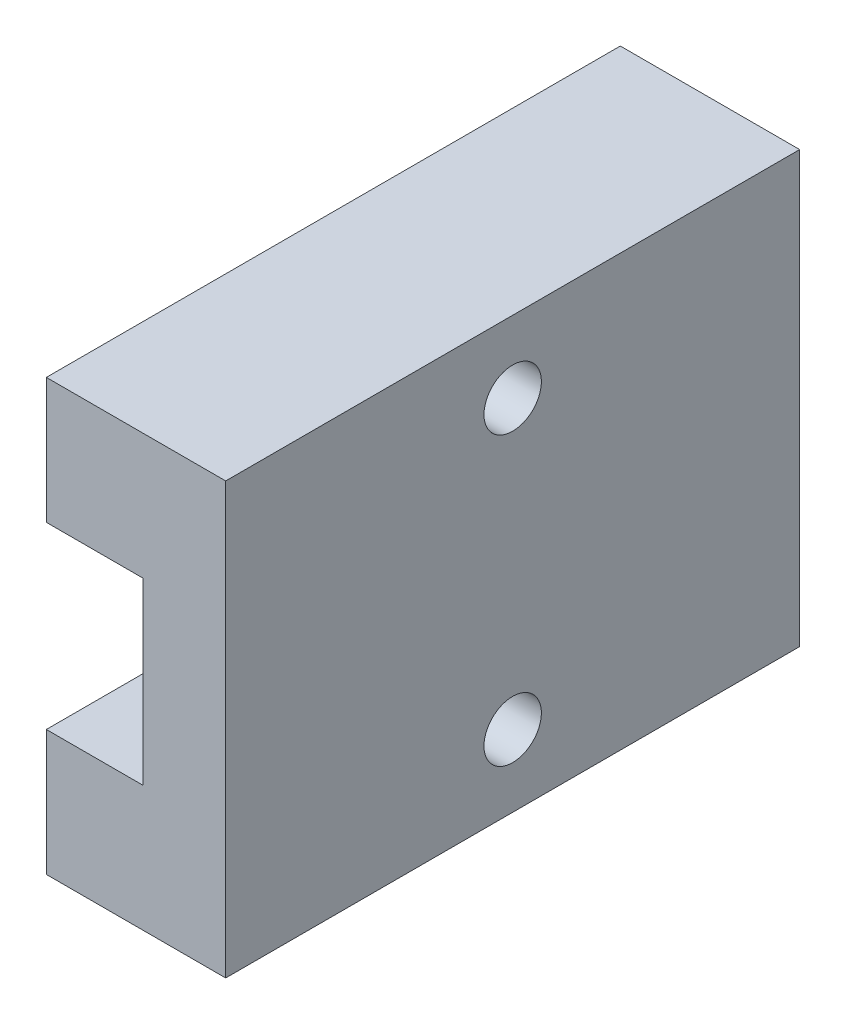
ISO-10303-21;
HEADER;
FILE_DESCRIPTION(('STEP AP214'),'2;1');
FILE_NAME('part.step','',(''),(''),'','','');
FILE_SCHEMA(('AUTOMOTIVE_DESIGN { 1 0 10303 214 1 1 1 1 }'));
ENDSEC;
DATA;
#1=APPLICATION_CONTEXT('core data for automotive mechanical design processes');
#2=APPLICATION_PROTOCOL_DEFINITION('international standard','automotive_design',2000,#1);
#3=PRODUCT_CONTEXT('',#1,'mechanical');
#4=PRODUCT('Part','Part','',(#3));
#5=PRODUCT_RELATED_PRODUCT_CATEGORY('part','',(#4));
#6=PRODUCT_DEFINITION_FORMATION('','',#4);
#7=PRODUCT_DEFINITION_CONTEXT('part definition',#1,'design');
#8=PRODUCT_DEFINITION('design','',#6,#7);
#9=PRODUCT_DEFINITION_SHAPE('','',#8);
#10=(LENGTH_UNIT() NAMED_UNIT(*) SI_UNIT(.MILLI.,.METRE.));
#11=(NAMED_UNIT(*) PLANE_ANGLE_UNIT() SI_UNIT($,.RADIAN.));
#12=(NAMED_UNIT(*) SI_UNIT($,.STERADIAN.) SOLID_ANGLE_UNIT());
#13=UNCERTAINTY_MEASURE_WITH_UNIT(LENGTH_MEASURE(1.E-05),#10,'distance_accuracy_value','');
#14=(GEOMETRIC_REPRESENTATION_CONTEXT(3) GLOBAL_UNCERTAINTY_ASSIGNED_CONTEXT((#13)) GLOBAL_UNIT_ASSIGNED_CONTEXT((#10,
#11,#12)) REPRESENTATION_CONTEXT('',''));
#15=CARTESIAN_POINT('',(0.,0.,0.));
#16=DIRECTION('',(0.,0.,1.));
#17=DIRECTION('',(1.,0.,0.));
#18=AXIS2_PLACEMENT_3D('',#15,#16,#17);
#19=CARTESIAN_POINT('',(-4.5,4.,81.949300195452));
#20=DIRECTION('',(1.,0.,0.));
#21=DIRECTION('',(0.,0.,1.));
#22=AXIS2_PLACEMENT_3D('',#19,#20,#21);
#23=CYLINDRICAL_SURFACE('',#22,0.8);
#24=CARTESIAN_POINT('',(-7.7,4.,81.949300195452));
#25=DIRECTION('',(1.,0.,0.));
#26=DIRECTION('',(0.,0.,1.));
#27=AXIS2_PLACEMENT_3D('',#24,#25,#26);
#28=CIRCLE('',#27,0.8);
#29=CARTESIAN_POINT('',(-7.7,4.,82.749300195452));
#30=VERTEX_POINT('',#29);
#31=EDGE_CURVE('E11',#30,#30,#28,.T.);
#32=ORIENTED_EDGE('',*,*,#31,.F.);
#33=EDGE_LOOP('',(#32));
#34=FACE_BOUND('',#33,.T.);
#35=CARTESIAN_POINT('',(-4.5,4.,81.949300195452));
#36=DIRECTION('',(1.,0.,0.));
#37=DIRECTION('',(0.,0.,1.));
#38=AXIS2_PLACEMENT_3D('',#35,#36,#37);
#39=CIRCLE('',#38,0.79999999999999);
#40=CARTESIAN_POINT('',(-4.5,4.,82.749300195452));
#41=VERTEX_POINT('',#40);
#42=EDGE_CURVE('E149',#41,#41,#39,.T.);
#43=ORIENTED_EDGE('',*,*,#42,.T.);
#44=EDGE_LOOP('',(#43));
#45=FACE_BOUND('',#44,.T.);
#46=ADVANCED_FACE('F36',(#34,#45),#23,.F.);
#47=CARTESIAN_POINT('',(-7.7,4.,81.949300195452));
#48=DIRECTION('',(1.,0.,0.));
#49=DIRECTION('',(0.,0.,1.));
#50=AXIS2_PLACEMENT_3D('',#47,#48,#49);
#51=CONICAL_SURFACE('',#50,0.8,1.02974425867665);
#52=CARTESIAN_POINT('',(-8.18068849522205,4.,81.949300195452));
#53=VERTEX_POINT('',#52);
#54=VERTEX_LOOP('',#53);
#55=FACE_BOUND('',#54,.T.);
#56=ORIENTED_EDGE('',*,*,#31,.T.);
#57=EDGE_LOOP('',(#56));
#58=FACE_BOUND('',#57,.T.);
#59=ADVANCED_FACE('F333',(#55,#58),#51,.F.);
#60=CARTESIAN_POINT('',(-4.5,-4.,81.949300195452));
#61=DIRECTION('',(1.,0.,0.));
#62=DIRECTION('',(0.,0.,1.));
#63=AXIS2_PLACEMENT_3D('',#60,#61,#62);
#64=CYLINDRICAL_SURFACE('',#63,0.8);
#65=CARTESIAN_POINT('',(-7.7,-4.,81.949300195452));
#66=DIRECTION('',(1.,0.,0.));
#67=DIRECTION('',(0.,0.,1.));
#68=AXIS2_PLACEMENT_3D('',#65,#66,#67);
#69=CIRCLE('',#68,0.8);
#70=CARTESIAN_POINT('',(-7.7,-4.,82.749300195452));
#71=VERTEX_POINT('',#70);
#72=EDGE_CURVE('E46',#71,#71,#69,.T.);
#73=ORIENTED_EDGE('',*,*,#72,.F.);
#74=EDGE_LOOP('',(#73));
#75=FACE_BOUND('',#74,.T.);
#76=CARTESIAN_POINT('',(-4.5,-4.,81.949300195452));
#77=DIRECTION('',(1.,0.,0.));
#78=DIRECTION('',(0.,0.,1.));
#79=AXIS2_PLACEMENT_3D('',#76,#77,#78);
#80=CIRCLE('',#79,0.79999999999999);
#81=CARTESIAN_POINT('',(-4.5,-4.,82.749300195452));
#82=VERTEX_POINT('',#81);
#83=EDGE_CURVE('E196',#82,#82,#80,.T.);
#84=ORIENTED_EDGE('',*,*,#83,.T.);
#85=EDGE_LOOP('',(#84));
#86=FACE_BOUND('',#85,.T.);
#87=ADVANCED_FACE('F38',(#75,#86),#64,.F.);
#88=CARTESIAN_POINT('',(-7.7,-4.,81.949300195452));
#89=DIRECTION('',(1.,0.,0.));
#90=DIRECTION('',(0.,0.,1.));
#91=AXIS2_PLACEMENT_3D('',#88,#89,#90);
#92=CONICAL_SURFACE('',#91,0.8,1.02974425867665);
#93=CARTESIAN_POINT('',(-8.18068849522205,-4.,81.949300195452));
#94=VERTEX_POINT('',#93);
#95=VERTEX_LOOP('',#94);
#96=FACE_BOUND('',#95,.T.);
#97=ORIENTED_EDGE('',*,*,#72,.T.);
#98=EDGE_LOOP('',(#97));
#99=FACE_BOUND('',#98,.T.);
#100=ADVANCED_FACE('F136',(#96,#99),#92,.F.);
#101=CARTESIAN_POINT('',(-6.8,0.,73.949300195452));
#102=DIRECTION('',(1.,0.,0.));
#103=DIRECTION('',(0.,-1.,0.));
#104=AXIS2_PLACEMENT_3D('',#101,#102,#103);
#105=PLANE('',#104);
#106=DIRECTION('',(0.,1.,0.));
#107=VECTOR('',#106,1.);
#108=CARTESIAN_POINT('',(-6.8,0.,89.949300195452));
#109=LINE('',#108,#107);
#110=CARTESIAN_POINT('',(-6.8,-2.5,89.949300195452));
#111=VERTEX_POINT('',#110);
#112=CARTESIAN_POINT('',(-6.8,2.5,89.949300195452));
#113=VERTEX_POINT('',#112);
#114=EDGE_CURVE('E205',#111,#113,#109,.T.);
#115=ORIENTED_EDGE('',*,*,#114,.T.);
#116=DIRECTION('',(0.,0.,-1.));
#117=VECTOR('',#116,1.);
#118=CARTESIAN_POINT('',(-6.8,2.5,93.9106374606166));
#119=LINE('',#118,#117);
#120=CARTESIAN_POINT('',(-6.8,2.5,73.949300195452));
#121=VERTEX_POINT('',#120);
#122=EDGE_CURVE('E144',#113,#121,#119,.T.);
#123=ORIENTED_EDGE('',*,*,#122,.T.);
#124=DIRECTION('',(0.,1.,0.));
#125=VECTOR('',#124,1.);
#126=CARTESIAN_POINT('',(-6.8,0.,73.949300195452));
#127=LINE('',#126,#125);
#128=CARTESIAN_POINT('',(-6.8,-2.5,73.949300195452));
#129=VERTEX_POINT('',#128);
#130=EDGE_CURVE('E155',#129,#121,#127,.T.);
#131=ORIENTED_EDGE('',*,*,#130,.F.);
#132=DIRECTION('',(0.,0.,1.));
#133=VECTOR('',#132,1.);
#134=CARTESIAN_POINT('',(-6.8,-2.5,93.9106374606166));
#135=LINE('',#134,#133);
#136=EDGE_CURVE('E139',#129,#111,#135,.T.);
#137=ORIENTED_EDGE('',*,*,#136,.T.);
#138=EDGE_LOOP('',(#115,#123,#131,#137));
#139=FACE_BOUND('',#138,.T.);
#140=ADVANCED_FACE('F313',(#139),#105,.F.);
#141=CARTESIAN_POINT('',(-6.8,-2.5,93.9106374606166));
#142=DIRECTION('',(0.,-1.,0.));
#143=DIRECTION('',(1.,0.,0.));
#144=AXIS2_PLACEMENT_3D('',#141,#142,#143);
#145=PLANE('',#144);
#146=DIRECTION('',(1.,0.,0.));
#147=VECTOR('',#146,1.);
#148=CARTESIAN_POINT('',(-7.,-2.5,89.949300195452));
#149=LINE('',#148,#147);
#150=CARTESIAN_POINT('',(-9.5,-2.5,89.949300195452));
#151=VERTEX_POINT('',#150);
#152=EDGE_CURVE('E215',#151,#111,#149,.T.);
#153=ORIENTED_EDGE('',*,*,#152,.T.);
#154=ORIENTED_EDGE('',*,*,#136,.F.);
#155=DIRECTION('',(1.,0.,0.));
#156=VECTOR('',#155,1.);
#157=CARTESIAN_POINT('',(-7.,-2.5,73.949300195452));
#158=LINE('',#157,#156);
#159=CARTESIAN_POINT('',(-9.5,-2.5,73.949300195452));
#160=VERTEX_POINT('',#159);
#161=EDGE_CURVE('E154',#160,#129,#158,.T.);
#162=ORIENTED_EDGE('',*,*,#161,.F.);
#163=DIRECTION('',(0.,0.,1.));
#164=VECTOR('',#163,1.);
#165=CARTESIAN_POINT('',(-9.5,-2.5,93.9106374606166));
#166=LINE('',#165,#164);
#167=EDGE_CURVE('E186',#160,#151,#166,.T.);
#168=ORIENTED_EDGE('',*,*,#167,.T.);
#169=EDGE_LOOP('',(#153,#154,#162,#168));
#170=FACE_BOUND('',#169,.T.);
#171=ADVANCED_FACE('F304',(#170),#145,.F.);
#172=CARTESIAN_POINT('',(-6.8,2.5,93.9106374606166));
#173=DIRECTION('',(0.,1.,0.));
#174=DIRECTION('',(1.,0.,0.));
#175=AXIS2_PLACEMENT_3D('',#172,#173,#174);
#176=PLANE('',#175);
#177=DIRECTION('',(-1.,0.,0.));
#178=VECTOR('',#177,1.);
#179=CARTESIAN_POINT('',(-7.,2.5,89.949300195452));
#180=LINE('',#179,#178);
#181=CARTESIAN_POINT('',(-9.5,2.5,89.949300195452));
#182=VERTEX_POINT('',#181);
#183=EDGE_CURVE('E199',#113,#182,#180,.T.);
#184=ORIENTED_EDGE('',*,*,#183,.T.);
#185=DIRECTION('',(0.,0.,-1.));
#186=VECTOR('',#185,1.);
#187=CARTESIAN_POINT('',(-9.5,2.5,93.9106374606166));
#188=LINE('',#187,#186);
#189=CARTESIAN_POINT('',(-9.5,2.5,73.949300195452));
#190=VERTEX_POINT('',#189);
#191=EDGE_CURVE('E185',#182,#190,#188,.T.);
#192=ORIENTED_EDGE('',*,*,#191,.T.);
#193=DIRECTION('',(-1.,0.,0.));
#194=VECTOR('',#193,1.);
#195=CARTESIAN_POINT('',(-7.,2.5,73.949300195452));
#196=LINE('',#195,#194);
#197=EDGE_CURVE('E151',#121,#190,#196,.T.);
#198=ORIENTED_EDGE('',*,*,#197,.F.);
#199=ORIENTED_EDGE('',*,*,#122,.F.);
#200=EDGE_LOOP('',(#184,#192,#198,#199));
#201=FACE_BOUND('',#200,.T.);
#202=ADVANCED_FACE('F265',(#201),#176,.F.);
#203=CARTESIAN_POINT('',(-7.,0.,73.949300195452));
#204=DIRECTION('',(0.,0.,1.));
#205=DIRECTION('',(0.,-1.,0.));
#206=AXIS2_PLACEMENT_3D('',#203,#204,#205);
#207=PLANE('',#206);
#208=ORIENTED_EDGE('',*,*,#130,.T.);
#209=ORIENTED_EDGE('',*,*,#197,.T.);
#210=DIRECTION('',(0.,-1.,0.));
#211=VECTOR('',#210,1.);
#212=CARTESIAN_POINT('',(-9.5,-6.,73.949300195452));
#213=LINE('',#212,#211);
#214=CARTESIAN_POINT('',(-9.5,6.,73.949300195452));
#215=VERTEX_POINT('',#214);
#216=EDGE_CURVE('E181',#215,#190,#213,.T.);
#217=ORIENTED_EDGE('',*,*,#216,.F.);
#218=DIRECTION('',(-1.,0.,0.));
#219=VECTOR('',#218,1.);
#220=CARTESIAN_POINT('',(-9.5,6.,73.949300195452));
#221=LINE('',#220,#219);
#222=CARTESIAN_POINT('',(-4.5,6.,73.949300195452));
#223=VERTEX_POINT('',#222);
#224=EDGE_CURVE('E168',#223,#215,#221,.T.);
#225=ORIENTED_EDGE('',*,*,#224,.F.);
#226=DIRECTION('',(0.,1.,0.));
#227=VECTOR('',#226,1.);
#228=CARTESIAN_POINT('',(-4.5,-6.,73.949300195452));
#229=LINE('',#228,#227);
#230=CARTESIAN_POINT('',(-4.5,-6.,73.949300195452));
#231=VERTEX_POINT('',#230);
#232=EDGE_CURVE('E150',#231,#223,#229,.T.);
#233=ORIENTED_EDGE('',*,*,#232,.F.);
#234=DIRECTION('',(1.,0.,0.));
#235=VECTOR('',#234,1.);
#236=CARTESIAN_POINT('',(-9.5,-6.,73.949300195452));
#237=LINE('',#236,#235);
#238=CARTESIAN_POINT('',(-9.5,-6.,73.949300195452));
#239=VERTEX_POINT('',#238);
#240=EDGE_CURVE('E40',#239,#231,#237,.T.);
#241=ORIENTED_EDGE('',*,*,#240,.F.);
#242=DIRECTION('',(0.,-1.,0.));
#243=VECTOR('',#242,1.);
#244=CARTESIAN_POINT('',(-9.5,-6.,73.949300195452));
#245=LINE('',#244,#243);
#246=EDGE_CURVE('E173',#160,#239,#245,.T.);
#247=ORIENTED_EDGE('',*,*,#246,.F.);
#248=ORIENTED_EDGE('',*,*,#161,.T.);
#249=EDGE_LOOP('',(#208,#209,#217,#225,#233,#241,#247,#248));
#250=FACE_BOUND('',#249,.T.);
#251=ADVANCED_FACE('F244',(#250),#207,.F.);
#252=CARTESIAN_POINT('',(-7.,0.,89.949300195452));
#253=DIRECTION('',(0.,0.,1.));
#254=DIRECTION('',(0.,-1.,0.));
#255=AXIS2_PLACEMENT_3D('',#252,#253,#254);
#256=PLANE('',#255);
#257=ORIENTED_EDGE('',*,*,#183,.F.);
#258=ORIENTED_EDGE('',*,*,#114,.F.);
#259=ORIENTED_EDGE('',*,*,#152,.F.);
#260=DIRECTION('',(0.,-1.,0.));
#261=VECTOR('',#260,1.);
#262=CARTESIAN_POINT('',(-9.5,-6.,89.949300195452));
#263=LINE('',#262,#261);
#264=CARTESIAN_POINT('',(-9.5,-6.,89.949300195452));
#265=VERTEX_POINT('',#264);
#266=EDGE_CURVE('E190',#151,#265,#263,.T.);
#267=ORIENTED_EDGE('',*,*,#266,.T.);
#268=DIRECTION('',(1.,0.,0.));
#269=VECTOR('',#268,1.);
#270=CARTESIAN_POINT('',(-9.5,-6.,89.949300195452));
#271=LINE('',#270,#269);
#272=CARTESIAN_POINT('',(-4.5,-6.,89.949300195452));
#273=VERTEX_POINT('',#272);
#274=EDGE_CURVE('E156',#265,#273,#271,.T.);
#275=ORIENTED_EDGE('',*,*,#274,.T.);
#276=DIRECTION('',(0.,1.,0.));
#277=VECTOR('',#276,1.);
#278=CARTESIAN_POINT('',(-4.5,-6.,89.949300195452));
#279=LINE('',#278,#277);
#280=CARTESIAN_POINT('',(-4.5,6.,89.949300195452));
#281=VERTEX_POINT('',#280);
#282=EDGE_CURVE('E147',#273,#281,#279,.T.);
#283=ORIENTED_EDGE('',*,*,#282,.T.);
#284=DIRECTION('',(-1.,0.,0.));
#285=VECTOR('',#284,1.);
#286=CARTESIAN_POINT('',(-9.5,6.,89.949300195452));
#287=LINE('',#286,#285);
#288=CARTESIAN_POINT('',(-9.5,6.,89.949300195452));
#289=VERTEX_POINT('',#288);
#290=EDGE_CURVE('E164',#281,#289,#287,.T.);
#291=ORIENTED_EDGE('',*,*,#290,.T.);
#292=DIRECTION('',(0.,-1.,0.));
#293=VECTOR('',#292,1.);
#294=CARTESIAN_POINT('',(-9.5,-6.,89.949300195452));
#295=LINE('',#294,#293);
#296=EDGE_CURVE('E178',#289,#182,#295,.T.);
#297=ORIENTED_EDGE('',*,*,#296,.T.);
#298=EDGE_LOOP('',(#257,#258,#259,#267,#275,#283,#291,#297));
#299=FACE_BOUND('',#298,.T.);
#300=ADVANCED_FACE('F252',(#299),#256,.T.);
#301=CARTESIAN_POINT('',(-4.5,-6.,89.949300195452));
#302=DIRECTION('',(-1.,0.,0.));
#303=DIRECTION('',(0.,0.,-1.));
#304=AXIS2_PLACEMENT_3D('',#301,#302,#303);
#305=PLANE('',#304);
#306=ORIENTED_EDGE('',*,*,#83,.F.);
#307=EDGE_LOOP('',(#306));
#308=FACE_BOUND('',#307,.T.);
#309=ORIENTED_EDGE('',*,*,#42,.F.);
#310=EDGE_LOOP('',(#309));
#311=FACE_BOUND('',#310,.T.);
#312=ORIENTED_EDGE('',*,*,#232,.T.);
#313=DIRECTION('',(0.,0.,-1.));
#314=VECTOR('',#313,1.);
#315=CARTESIAN_POINT('',(-4.5,6.,89.949300195452));
#316=LINE('',#315,#314);
#317=EDGE_CURVE('E167',#281,#223,#316,.T.);
#318=ORIENTED_EDGE('',*,*,#317,.F.);
#319=ORIENTED_EDGE('',*,*,#282,.F.);
#320=DIRECTION('',(0.,0.,-1.));
#321=VECTOR('',#320,1.);
#322=CARTESIAN_POINT('',(-4.5,-6.,89.949300195452));
#323=LINE('',#322,#321);
#324=EDGE_CURVE('E160',#273,#231,#323,.T.);
#325=ORIENTED_EDGE('',*,*,#324,.T.);
#326=EDGE_LOOP('',(#312,#318,#319,#325));
#327=FACE_BOUND('',#326,.T.);
#328=ADVANCED_FACE('F234',(#308,#311,#327),#305,.F.);
#329=CARTESIAN_POINT('',(-9.5,-6.,89.949300195452));
#330=DIRECTION('',(0.,1.,0.));
#331=DIRECTION('',(0.,0.,1.));
#332=AXIS2_PLACEMENT_3D('',#329,#330,#331);
#333=PLANE('',#332);
#334=ORIENTED_EDGE('',*,*,#240,.T.);
#335=ORIENTED_EDGE('',*,*,#324,.F.);
#336=ORIENTED_EDGE('',*,*,#274,.F.);
#337=DIRECTION('',(0.,0.,-1.));
#338=VECTOR('',#337,1.);
#339=CARTESIAN_POINT('',(-9.5,-6.,89.949300195452));
#340=LINE('',#339,#338);
#341=EDGE_CURVE('E169',#265,#239,#340,.T.);
#342=ORIENTED_EDGE('',*,*,#341,.T.);
#343=EDGE_LOOP('',(#334,#335,#336,#342));
#344=FACE_BOUND('',#343,.T.);
#345=ADVANCED_FACE('F257',(#344),#333,.F.);
#346=CARTESIAN_POINT('',(-9.5,-6.,89.949300195452));
#347=DIRECTION('',(1.,0.,0.));
#348=DIRECTION('',(0.,-1.,0.));
#349=AXIS2_PLACEMENT_3D('',#346,#347,#348);
#350=PLANE('',#349);
#351=ORIENTED_EDGE('',*,*,#266,.F.);
#352=ORIENTED_EDGE('',*,*,#167,.F.);
#353=ORIENTED_EDGE('',*,*,#246,.T.);
#354=ORIENTED_EDGE('',*,*,#341,.F.);
#355=EDGE_LOOP('',(#351,#352,#353,#354));
#356=FACE_BOUND('',#355,.T.);
#357=ADVANCED_FACE('F270',(#356),#350,.F.);
#358=CARTESIAN_POINT('',(-9.5,6.,89.949300195452));
#359=DIRECTION('',(0.,-1.,0.));
#360=DIRECTION('',(0.,0.,1.));
#361=AXIS2_PLACEMENT_3D('',#358,#359,#360);
#362=PLANE('',#361);
#363=ORIENTED_EDGE('',*,*,#224,.T.);
#364=DIRECTION('',(0.,0.,-1.));
#365=VECTOR('',#364,1.);
#366=CARTESIAN_POINT('',(-9.5,6.,89.949300195452));
#367=LINE('',#366,#365);
#368=EDGE_CURVE('E174',#289,#215,#367,.T.);
#369=ORIENTED_EDGE('',*,*,#368,.F.);
#370=ORIENTED_EDGE('',*,*,#290,.F.);
#371=ORIENTED_EDGE('',*,*,#317,.T.);
#372=EDGE_LOOP('',(#363,#369,#370,#371));
#373=FACE_BOUND('',#372,.T.);
#374=ADVANCED_FACE('F241',(#373),#362,.F.);
#375=CARTESIAN_POINT('',(-9.5,-6.,89.949300195452));
#376=DIRECTION('',(1.,0.,0.));
#377=DIRECTION('',(0.,-1.,0.));
#378=AXIS2_PLACEMENT_3D('',#375,#376,#377);
#379=PLANE('',#378);
#380=ORIENTED_EDGE('',*,*,#216,.T.);
#381=ORIENTED_EDGE('',*,*,#191,.F.);
#382=ORIENTED_EDGE('',*,*,#296,.F.);
#383=ORIENTED_EDGE('',*,*,#368,.T.);
#384=EDGE_LOOP('',(#380,#381,#382,#383));
#385=FACE_BOUND('',#384,.T.);
#386=ADVANCED_FACE('F248',(#385),#379,.F.);
#387=CLOSED_SHELL('',(#46,#59,#87,#100,#140,#171,#202,#251,#300,#328,#345,#357,#374,#386));
#388=MANIFOLD_SOLID_BREP('B2',#387);
#389=ADVANCED_BREP_SHAPE_REPRESENTATION('',(#18,#388),#14);
#390=SHAPE_DEFINITION_REPRESENTATION(#9,#389);
ENDSEC;
END-ISO-10303-21;
